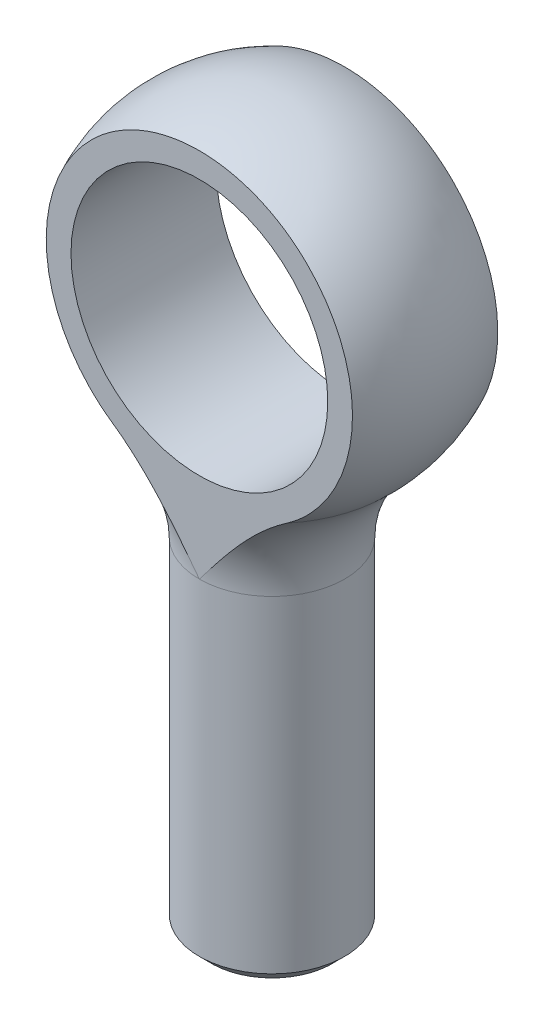
ISO-10303-21;
HEADER;
FILE_DESCRIPTION(('STEP AP214'),'2;1');
FILE_NAME('part.step','',(''),(''),'','','');
FILE_SCHEMA(('AUTOMOTIVE_DESIGN { 1 0 10303 214 1 1 1 1 }'));
ENDSEC;
DATA;
#1=APPLICATION_CONTEXT('core data for automotive mechanical design processes');
#2=APPLICATION_PROTOCOL_DEFINITION('international standard','automotive_design',2000,#1);
#3=PRODUCT_CONTEXT('',#1,'mechanical');
#4=PRODUCT('Part','Part','',(#3));
#5=PRODUCT_RELATED_PRODUCT_CATEGORY('part','',(#4));
#6=PRODUCT_DEFINITION_FORMATION('','',#4);
#7=PRODUCT_DEFINITION_CONTEXT('part definition',#1,'design');
#8=PRODUCT_DEFINITION('design','',#6,#7);
#9=PRODUCT_DEFINITION_SHAPE('','',#8);
#10=(LENGTH_UNIT() NAMED_UNIT(*) SI_UNIT(.MILLI.,.METRE.));
#11=(NAMED_UNIT(*) PLANE_ANGLE_UNIT() SI_UNIT($,.RADIAN.));
#12=(NAMED_UNIT(*) SI_UNIT($,.STERADIAN.) SOLID_ANGLE_UNIT());
#13=UNCERTAINTY_MEASURE_WITH_UNIT(LENGTH_MEASURE(1.E-05),#10,'distance_accuracy_value','');
#14=(GEOMETRIC_REPRESENTATION_CONTEXT(3) GLOBAL_UNCERTAINTY_ASSIGNED_CONTEXT((#13)) GLOBAL_UNIT_ASSIGNED_CONTEXT((#10,
#11,#12)) REPRESENTATION_CONTEXT('',''));
#15=CARTESIAN_POINT('',(0.,0.,0.));
#16=DIRECTION('',(0.,0.,1.));
#17=DIRECTION('',(1.,0.,0.));
#18=AXIS2_PLACEMENT_3D('',#15,#16,#17);
#19=CARTESIAN_POINT('',(-1.2490009027033E-13,0.,0.));
#20=DIRECTION('',(0.,-1.,0.));
#21=DIRECTION('',(1.,0.,0.));
#22=AXIS2_PLACEMENT_3D('',#19,#20,#21);
#23=TOROIDAL_SURFACE('',#22,25.7968750000002,16.271875);
#24=CARTESIAN_POINT('',(-1.2490009027033E-13,0.,-9.52500000000006));
#25=CARTESIAN_POINT('',(-0.005167452615442,0.00675402738967501,-9.52500000000004));
#26=CARTESIAN_POINT('',(-0.0103349050174557,0.0135080543500059,-9.52500000000002));
#27=CARTESIAN_POINT('',(-0.819890846154989,1.07162209413467,-9.52499999999671));
#28=CARTESIAN_POINT('',(-1.6243981365314,2.12287651508349,-9.52499999999914));
#29=CARTESIAN_POINT('',(-3.27258965228614,4.19596805092888,-9.52500000000086));
#30=CARTESIAN_POINT('',(-4.11629001539579,5.21779276254316,-9.52500000000016));
#31=CARTESIAN_POINT('',(-5.43422399427642,6.70108527546252,-9.52499999999992));
#32=CARTESIAN_POINT('',(-5.8814080549913,7.18643995510749,-9.52499999999998));
#33=CARTESIAN_POINT('',(-6.79686719335257,8.13675767374777,-9.52500000000002));
#34=CARTESIAN_POINT('',(-7.26513799072382,8.60172481360979,-9.52500000000001));
#35=CARTESIAN_POINT('',(-8.22494490587444,9.50596395638035,-9.525));
#36=CARTESIAN_POINT('',(-8.71645307517112,9.94526547401466,-9.525));
#37=CARTESIAN_POINT('',(-9.72489488562016,10.7934849178261,-9.525));
#38=CARTESIAN_POINT('',(-10.241820436259,11.2024124095215,-9.525));
#39=CARTESIAN_POINT('',(-11.2628755930654,11.9557231411914,-9.525));
#40=CARTESIAN_POINT('',(-11.7651280785616,12.3026429432189,-9.525));
#41=CARTESIAN_POINT('',(-12.7921557222474,12.9615466290334,-9.525));
#42=CARTESIAN_POINT('',(-13.3169312060761,13.2735300074716,-9.525));
#43=CARTESIAN_POINT('',(-14.3887181444806,13.8585078038558,-9.525));
#44=CARTESIAN_POINT('',(-14.9357565296614,14.1314530825034,-9.525));
#45=CARTESIAN_POINT('',(-16.0496474100231,14.6335522772498,-9.525));
#46=CARTESIAN_POINT('',(-16.6164996348075,14.8627067906792,-9.525));
#47=CARTESIAN_POINT('',(-17.7719232113065,15.2747207529869,-9.525));
#48=CARTESIAN_POINT('',(-18.3606307941651,15.457200062585,-9.525));
#49=CARTESIAN_POINT('',(-19.5519253088343,15.769593000701,-9.525));
#50=CARTESIAN_POINT('',(-20.1545126260029,15.8995051678767,-9.525));
#51=CARTESIAN_POINT('',(-21.3688005261816,16.1032807027354,-9.525));
#52=CARTESIAN_POINT('',(-21.9804956699349,16.1771762549466,-9.525));
#53=CARTESIAN_POINT('',(-23.2081704713034,16.266218142429,-9.525));
#54=CARTESIAN_POINT('',(-23.8241496986913,16.2813702940162,-9.525));
#55=CARTESIAN_POINT('',(-25.0081486066532,16.2520051051225,-9.525));
#56=CARTESIAN_POINT('',(-25.5762785257975,16.2119057671712,-9.525));
#57=CARTESIAN_POINT('',(-26.7063292474793,16.0786886494223,-9.525));
#58=CARTESIAN_POINT('',(-27.2682502225397,15.9855723465587,-9.525));
#59=CARTESIAN_POINT('',(-28.3802273242851,15.7460173734579,-9.525));
#60=CARTESIAN_POINT('',(-28.930291440638,15.599615879684,-9.525));
#61=CARTESIAN_POINT('',(-30.0134900419584,15.2537865231115,-9.525));
#62=CARTESIAN_POINT('',(-30.5466262905328,15.0543642046415,-9.525));
#63=CARTESIAN_POINT('',(-31.5292408711952,14.6299727961571,-9.525));
#64=CARTESIAN_POINT('',(-31.9812019552055,14.4107350632246,-9.525));
#65=CARTESIAN_POINT('',(-32.8637755631185,13.9329731540565,-9.525));
#66=CARTESIAN_POINT('',(-33.2943917662423,13.6744557799101,-9.525));
#67=CARTESIAN_POINT('',(-34.1319594796922,13.1188138009447,-9.525));
#68=CARTESIAN_POINT('',(-34.5388346338099,12.8215736051812,-9.525));
#69=CARTESIAN_POINT('',(-35.1275294290994,12.3488461200751,-9.525));
#70=CARTESIAN_POINT('',(-35.3202205869429,12.1867320448451,-9.525));
#71=CARTESIAN_POINT('',(-35.697971760415,11.8538322993533,-9.525));
#72=CARTESIAN_POINT('',(-35.8830315176103,11.6830463358587,-9.525));
#73=CARTESIAN_POINT('',(-36.0640839624217,11.5080600593659,-9.525));
#74=B_SPLINE_CURVE_WITH_KNOTS('',3,(#24,#25,#26,#27,#28,#29,#30,#31,#32,#33,#34,#35,#36,#37,#38,
#39,#40,#41,#42,#43,#44,#45,#46,#47,#48,#49,#50,#51,#52,#53,#54,#55,#56,#57,#58,#59,#60,#61,#62,
#63,#64,#65,#66,#67,#68,#69,#70,#71,#72,#73),.UNSPECIFIED.,.F.,.F.,(4,2,2,2,2,2,2,2,2,2,2,2,2,2,
2,2,2,2,2,2,2,2,2,2,4),(0.,0.0255122519586187,3.99685840168091,7.96985450188092,
9.94918880689772,11.9281231335206,13.9047350367502,15.8807217941987,17.7106923889335,
19.5406894504273,21.3729701255459,23.205225805549,25.0519602233873,26.8987459760645,
28.744469846074,30.5900109621519,32.2962353715926,34.0024122517676,35.7074010267239,
37.4122115829745,38.9172645106138,40.4220571033628,41.9314492191524,42.6866649313001,
43.4419061974647),.UNSPECIFIED.);
#75=CARTESIAN_POINT('',(-1.2490009027033E-13,0.,-9.525));
#76=VERTEX_POINT('',#75);
#77=CARTESIAN_POINT('',(-11.4488886923738,12.0780927835052,-9.525));
#78=VERTEX_POINT('',#77);
#79=EDGE_CURVE('E60',#76,#78,#74,.T.);
#80=ORIENTED_EDGE('',*,*,#79,.F.);
#81=CARTESIAN_POINT('',(0.,0.,0.));
#82=DIRECTION('',(0.,1.,0.));
#83=DIRECTION('',(-1.,0.,0.));
#84=AXIS2_PLACEMENT_3D('',#81,#82,#83);
#85=CIRCLE('',#84,9.525);
#86=CARTESIAN_POINT('',(-1.2490009027033E-13,0.,9.525));
#87=VERTEX_POINT('',#86);
#88=EDGE_CURVE('E88',#76,#87,#85,.T.);
#89=ORIENTED_EDGE('',*,*,#88,.T.);
#90=CARTESIAN_POINT('',(-1.2490009027033E-13,0.,9.52500000000006));
#91=CARTESIAN_POINT('',(-0.00516745261544182,0.00675402738967626,9.52500000000004));
#92=CARTESIAN_POINT('',(-0.0103349050174554,0.0135080543500073,9.52500000000002));
#93=CARTESIAN_POINT('',(-0.819890846155014,1.07162209413477,9.52499999999671));
#94=CARTESIAN_POINT('',(-1.6243981365315,2.12287651508363,9.52499999999914));
#95=CARTESIAN_POINT('',(-3.27258965228637,4.19596805092915,9.52500000000086));
#96=CARTESIAN_POINT('',(-4.11629001539607,5.21779276254349,9.52500000000016));
#97=CARTESIAN_POINT('',(-5.43422399427681,6.70108527546294,9.52499999999992));
#98=CARTESIAN_POINT('',(-5.88140805499172,7.18643995510794,9.52499999999998));
#99=CARTESIAN_POINT('',(-6.79686719335306,8.13675767374828,9.52500000000002));
#100=CARTESIAN_POINT('',(-7.26513799072436,8.60172481361032,9.52500000000001));
#101=CARTESIAN_POINT('',(-8.22494490587507,9.50596395638092,9.525));
#102=CARTESIAN_POINT('',(-8.71645307517178,9.94526547401525,9.525));
#103=CARTESIAN_POINT('',(-9.72489488562091,10.7934849178267,9.525));
#104=CARTESIAN_POINT('',(-10.2418204362598,11.2024124095222,9.525));
#105=CARTESIAN_POINT('',(-11.2628755930662,11.955723141192,9.525));
#106=CARTESIAN_POINT('',(-11.7651280785624,12.3026429432195,9.525));
#107=CARTESIAN_POINT('',(-12.7921557222482,12.9615466290339,9.525));
#108=CARTESIAN_POINT('',(-13.3169312060769,13.2735300074721,9.525));
#109=CARTESIAN_POINT('',(-14.3887181444814,13.8585078038562,9.525));
#110=CARTESIAN_POINT('',(-14.9357565296621,14.1314530825037,9.525));
#111=CARTESIAN_POINT('',(-16.0496474100238,14.6335522772501,9.525));
#112=CARTESIAN_POINT('',(-16.6164996348082,14.8627067906795,9.525));
#113=CARTESIAN_POINT('',(-17.7719232113071,15.2747207529872,9.525));
#114=CARTESIAN_POINT('',(-18.3606307941657,15.4572000625852,9.525));
#115=CARTESIAN_POINT('',(-19.5519253088349,15.7695930007012,9.525));
#116=CARTESIAN_POINT('',(-20.1545126260035,15.8995051678768,9.525));
#117=CARTESIAN_POINT('',(-21.3688005261821,16.1032807027355,9.525));
#118=CARTESIAN_POINT('',(-21.9804956699354,16.1771762549467,9.525));
#119=CARTESIAN_POINT('',(-23.2081704713038,16.266218142429,9.525));
#120=CARTESIAN_POINT('',(-23.8241496986917,16.2813702940162,9.525));
#121=CARTESIAN_POINT('',(-25.0081486066536,16.2520051051225,9.525));
#122=CARTESIAN_POINT('',(-25.5762785257978,16.2119057671711,9.525));
#123=CARTESIAN_POINT('',(-26.7063292474797,16.0786886494223,9.525));
#124=CARTESIAN_POINT('',(-27.26825022254,15.9855723465586,9.525));
#125=CARTESIAN_POINT('',(-28.3802273242854,15.7460173734578,9.525));
#126=CARTESIAN_POINT('',(-28.9302914406383,15.5996158796839,9.525));
#127=CARTESIAN_POINT('',(-30.0134900419587,15.2537865231113,9.525));
#128=CARTESIAN_POINT('',(-30.5466262905331,15.0543642046414,9.525));
#129=CARTESIAN_POINT('',(-31.5292408711955,14.6299727961569,9.525));
#130=CARTESIAN_POINT('',(-31.9812019552058,14.4107350632245,9.525));
#131=CARTESIAN_POINT('',(-32.8637755631187,13.9329731540564,9.525));
#132=CARTESIAN_POINT('',(-33.2943917662426,13.67445577991,9.525));
#133=CARTESIAN_POINT('',(-34.1319594796924,13.1188138009445,9.525));
#134=CARTESIAN_POINT('',(-34.5388346338101,12.821573605181,9.525));
#135=CARTESIAN_POINT('',(-35.1275294290996,12.3488461200749,9.525));
#136=CARTESIAN_POINT('',(-35.3202205869431,12.186732044845,9.525));
#137=CARTESIAN_POINT('',(-35.6979717604152,11.8538322993531,9.525));
#138=CARTESIAN_POINT('',(-35.8830315176105,11.6830463358585,9.525));
#139=CARTESIAN_POINT('',(-36.0640839624219,11.5080600593657,9.525));
#140=B_SPLINE_CURVE_WITH_KNOTS('',3,(#90,#91,#92,#93,#94,#95,#96,#97,#98,#99,#100,#101,#102,
#103,#104,#105,#106,#107,#108,#109,#110,#111,#112,#113,#114,#115,#116,#117,#118,#119,#120,#121,
#122,#123,#124,#125,#126,#127,#128,#129,#130,#131,#132,#133,#134,#135,#136,#137,#138,#139),
.UNSPECIFIED.,.F.,.F.,(4,2,2,2,2,2,2,2,2,2,2,2,2,2,2,2,2,2,2,2,2,2,2,2,4),(0.,
0.0255122519586187,3.99685840168117,7.96985450188145,9.94918880689839,11.9281231335214,
13.9047350367512,15.8807217941998,17.7106923889345,19.5406894504282,21.3729701255468,
23.2052258055497,25.0519602233879,26.8987459760651,28.7444698460745,30.5900109621523,
32.2962353715929,34.002412251768,35.7074010267242,37.4122115829748,38.9172645106141,
40.4220571033631,41.9314492191527,42.6866649313003,43.441906197465),.UNSPECIFIED.);
#141=CARTESIAN_POINT('',(-11.4488886923738,12.0780927835052,9.525));
#142=VERTEX_POINT('',#141);
#143=EDGE_CURVE('E92',#142,#87,#140,.F.);
#144=ORIENTED_EDGE('',*,*,#143,.F.);
#145=CARTESIAN_POINT('',(0.,12.0780927835052,0.));
#146=DIRECTION('',(0.,-1.,0.));
#147=DIRECTION('',(1.,0.,0.));
#148=AXIS2_PLACEMENT_3D('',#145,#146,#147);
#149=CIRCLE('',#148,14.8930412371135);
#150=EDGE_CURVE('E91',#142,#78,#149,.T.);
#151=ORIENTED_EDGE('',*,*,#150,.T.);
#152=EDGE_LOOP('',(#80,#89,#144,#151));
#153=FACE_BOUND('',#152,.T.);
#154=ADVANCED_FACE('F46',(#153),#23,.F.);
#155=CARTESIAN_POINT('',(0.,-44.45,0.));
#156=DIRECTION('',(0.,1.,0.));
#157=DIRECTION('',(-1.,0.,0.));
#158=AXIS2_PLACEMENT_3D('',#155,#156,#157);
#159=PLANE('',#158);
#160=CARTESIAN_POINT('',(0.,-44.45,0.));
#161=DIRECTION('',(0.,1.,0.));
#162=DIRECTION('',(-1.,0.,0.));
#163=AXIS2_PLACEMENT_3D('',#160,#161,#162);
#164=CIRCLE('',#163,7.93749999999998);
#165=CARTESIAN_POINT('',(-7.93749999999997,-44.45,0.));
#166=VERTEX_POINT('',#165);
#167=EDGE_CURVE('E103',#166,#166,#164,.F.);
#168=ORIENTED_EDGE('',*,*,#167,.T.);
#169=EDGE_LOOP('',(#168));
#170=FACE_BOUND('',#169,.T.);
#171=ADVANCED_FACE('F140',(#170),#159,.F.);
#172=CARTESIAN_POINT('',(0.,50.8,0.));
#173=DIRECTION('',(0.,1.,0.));
#174=DIRECTION('',(-1.,0.,0.));
#175=AXIS2_PLACEMENT_3D('',#172,#173,#174);
#176=CYLINDRICAL_SURFACE('',#175,9.525);
#177=CARTESIAN_POINT('',(0.,-42.8625,0.));
#178=DIRECTION('',(0.,1.,0.));
#179=DIRECTION('',(-1.,0.,0.));
#180=AXIS2_PLACEMENT_3D('',#177,#178,#179);
#181=CIRCLE('',#180,9.525);
#182=CARTESIAN_POINT('',(-9.525,-42.8625,0.));
#183=VERTEX_POINT('',#182);
#184=EDGE_CURVE('E101',#183,#183,#181,.T.);
#185=ORIENTED_EDGE('',*,*,#184,.T.);
#186=EDGE_LOOP('',(#185));
#187=FACE_BOUND('',#186,.T.);
#188=EDGE_CURVE('E97',#87,#76,#85,.T.);
#189=ORIENTED_EDGE('',*,*,#188,.F.);
#190=ORIENTED_EDGE('',*,*,#88,.F.);
#191=EDGE_LOOP('',(#189,#190));
#192=FACE_BOUND('',#191,.T.);
#193=ADVANCED_FACE('F96',(#187,#192),#176,.T.);
#194=CARTESIAN_POINT('',(0.,-42.8625,0.));
#195=DIRECTION('',(0.,1.,0.));
#196=DIRECTION('',(-1.,0.,0.));
#197=AXIS2_PLACEMENT_3D('',#194,#195,#196);
#198=CONICAL_SURFACE('',#197,9.525,0.78539816339745);
#199=ORIENTED_EDGE('',*,*,#167,.F.);
#200=EDGE_LOOP('',(#199));
#201=FACE_BOUND('',#200,.T.);
#202=ORIENTED_EDGE('',*,*,#184,.F.);
#203=EDGE_LOOP('',(#202));
#204=FACE_BOUND('',#203,.T.);
#205=ADVANCED_FACE('F48',(#201,#204),#198,.T.);
#206=CARTESIAN_POINT('',(-1.2490009027033E-13,0.,-9.52500000000006));
#207=CARTESIAN_POINT('',(0.00516745261519223,0.00675402738967499,-9.52500000000004));
#208=CARTESIAN_POINT('',(0.010334905017206,0.0135080543500058,-9.52500000000002));
#209=CARTESIAN_POINT('',(0.819890846154744,1.07162209413467,-9.52499999999671));
#210=CARTESIAN_POINT('',(1.62439813653116,2.12287651508348,-9.52499999999914));
#211=CARTESIAN_POINT('',(3.27258965228591,4.19596805092887,-9.52500000000086));
#212=CARTESIAN_POINT('',(4.11629001539557,5.21779276254313,-9.52500000000016));
#213=CARTESIAN_POINT('',(5.4342239942762,6.70108527546249,-9.52499999999992));
#214=CARTESIAN_POINT('',(5.88140805499108,7.18643995510746,-9.52499999999998));
#215=CARTESIAN_POINT('',(6.79686719335235,8.13675767374774,-9.52500000000002));
#216=CARTESIAN_POINT('',(7.26513799072361,8.60172481360976,-9.52500000000001));
#217=CARTESIAN_POINT('',(8.22494490587424,9.50596395638031,-9.525));
#218=CARTESIAN_POINT('',(8.71645307517091,9.94526547401462,-9.525));
#219=CARTESIAN_POINT('',(9.72489488561996,10.7934849178261,-9.525));
#220=CARTESIAN_POINT('',(10.2418204362588,11.2024124095215,-9.525));
#221=CARTESIAN_POINT('',(11.2628755930652,11.9557231411914,-9.525));
#222=CARTESIAN_POINT('',(11.7651280785614,12.3026429432189,-9.525));
#223=CARTESIAN_POINT('',(12.7921557222472,12.9615466290333,-9.525));
#224=CARTESIAN_POINT('',(13.3169312060759,13.2735300074716,-9.525));
#225=CARTESIAN_POINT('',(14.3887181444804,13.8585078038557,-9.525));
#226=CARTESIAN_POINT('',(14.9357565296612,14.1314530825033,-9.525));
#227=CARTESIAN_POINT('',(16.0496474100229,14.6335522772498,-9.525));
#228=CARTESIAN_POINT('',(16.6164996348073,14.8627067906791,-9.525));
#229=CARTESIAN_POINT('',(17.7719232113063,15.2747207529869,-9.525));
#230=CARTESIAN_POINT('',(18.3606307941649,15.4572000625849,-9.525));
#231=CARTESIAN_POINT('',(19.5519253088341,15.7695930007009,-9.525));
#232=CARTESIAN_POINT('',(20.1545126260028,15.8995051678766,-9.525));
#233=CARTESIAN_POINT('',(21.3688005261814,16.1032807027353,-9.525));
#234=CARTESIAN_POINT('',(21.9804956699347,16.1771762549465,-9.525));
#235=CARTESIAN_POINT('',(23.2081704713032,16.2662181424289,-9.525));
#236=CARTESIAN_POINT('',(23.8241496986911,16.281370294016,-9.525));
#237=CARTESIAN_POINT('',(25.0081486066531,16.2520051051224,-9.525));
#238=CARTESIAN_POINT('',(25.5762785257973,16.2119057671711,-9.525));
#239=CARTESIAN_POINT('',(26.7063292474791,16.0786886494222,-9.525));
#240=CARTESIAN_POINT('',(27.2682502225395,15.9855723465585,-9.525));
#241=CARTESIAN_POINT('',(28.3802273242849,15.7460173734577,-9.525));
#242=CARTESIAN_POINT('',(28.9302914406378,15.5996158796838,-9.525));
#243=CARTESIAN_POINT('',(30.0134900419582,15.2537865231113,-9.525));
#244=CARTESIAN_POINT('',(30.5466262905326,15.0543642046414,-9.525));
#245=CARTESIAN_POINT('',(31.529240871195,14.6299727961569,-9.525));
#246=CARTESIAN_POINT('',(31.9812019552053,14.4107350632245,-9.525));
#247=CARTESIAN_POINT('',(32.8637755631183,13.9329731540564,-9.525));
#248=CARTESIAN_POINT('',(33.2943917662421,13.67445577991,-9.525));
#249=CARTESIAN_POINT('',(34.131959479692,13.1188138009445,-9.525));
#250=CARTESIAN_POINT('',(34.5388346338097,12.821573605181,-9.525));
#251=CARTESIAN_POINT('',(35.1275294290992,12.3488461200749,-9.525));
#252=CARTESIAN_POINT('',(35.3202205869427,12.186732044845,-9.525));
#253=CARTESIAN_POINT('',(35.6979717604148,11.8538322993531,-9.525));
#254=CARTESIAN_POINT('',(35.8830315176102,11.6830463358586,-9.525));
#255=CARTESIAN_POINT('',(36.0640839624215,11.5080600593657,-9.525));
#256=B_SPLINE_CURVE_WITH_KNOTS('',3,(#206,#207,#208,#209,#210,#211,#212,#213,#214,#215,#216,
#217,#218,#219,#220,#221,#222,#223,#224,#225,#226,#227,#228,#229,#230,#231,#232,#233,#234,#235,
#236,#237,#238,#239,#240,#241,#242,#243,#244,#245,#246,#247,#248,#249,#250,#251,#252,#253,#254,
#255),.UNSPECIFIED.,.F.,.F.,(4,2,2,2,2,2,2,2,2,2,2,2,2,2,2,2,2,2,2,2,2,2,2,2,4),(0.,
0.0255122519586188,3.99685840168091,7.96985450188092,9.94918880689772,11.9281231335206,
13.9047350367502,15.8807217941987,17.7106923889335,19.5406894504273,21.3729701255459,
23.205225805549,25.0519602233873,26.8987459760645,28.744469846074,30.5900109621519,
32.2962353715926,34.0024122517677,35.7074010267239,37.4122115829745,38.9172645106137,
40.4220571033628,41.9314492191524,42.6866649313001,43.4419061974647),.UNSPECIFIED.);
#257=CARTESIAN_POINT('',(11.4488886923736,12.0780927835052,-9.525));
#258=VERTEX_POINT('',#257);
#259=EDGE_CURVE('E79',#258,#76,#256,.F.);
#260=ORIENTED_EDGE('',*,*,#259,.F.);
#261=CARTESIAN_POINT('',(11.4488886923736,12.0780927835052,9.525));
#262=VERTEX_POINT('',#261);
#263=EDGE_CURVE('E68',#258,#262,#149,.T.);
#264=ORIENTED_EDGE('',*,*,#263,.T.);
#265=CARTESIAN_POINT('',(-1.2490009027033E-13,0.,9.52500000000006));
#266=CARTESIAN_POINT('',(0.00516745261519205,0.00675402738967624,9.52500000000004));
#267=CARTESIAN_POINT('',(0.0103349050172056,0.0135080543500072,9.52500000000002));
#268=CARTESIAN_POINT('',(0.819890846154769,1.07162209413476,9.52499999999671));
#269=CARTESIAN_POINT('',(1.62439813653126,2.12287651508363,9.52499999999914));
#270=CARTESIAN_POINT('',(3.27258965228613,4.19596805092914,9.52500000000086));
#271=CARTESIAN_POINT('',(4.11629001539585,5.21779276254347,9.52500000000016));
#272=CARTESIAN_POINT('',(5.43422399427659,6.70108527546292,9.52499999999992));
#273=CARTESIAN_POINT('',(5.8814080549915,7.18643995510791,9.52499999999998));
#274=CARTESIAN_POINT('',(6.79686719335285,8.13675767374825,9.52500000000002));
#275=CARTESIAN_POINT('',(7.26513799072415,8.60172481361029,9.52500000000001));
#276=CARTESIAN_POINT('',(8.22494490587486,9.50596395638088,9.525));
#277=CARTESIAN_POINT('',(8.71645307517158,9.9452654740152,9.525));
#278=CARTESIAN_POINT('',(9.72489488562071,10.7934849178267,9.525));
#279=CARTESIAN_POINT('',(10.2418204362596,11.2024124095221,9.525));
#280=CARTESIAN_POINT('',(11.262875593066,11.955723141192,9.525));
#281=CARTESIAN_POINT('',(11.7651280785622,12.3026429432194,9.525));
#282=CARTESIAN_POINT('',(12.792155722248,12.9615466290338,9.525));
#283=CARTESIAN_POINT('',(13.3169312060767,13.273530007472,9.525));
#284=CARTESIAN_POINT('',(14.3887181444812,13.8585078038561,9.525));
#285=CARTESIAN_POINT('',(14.9357565296619,14.1314530825037,9.525));
#286=CARTESIAN_POINT('',(16.0496474100237,14.6335522772501,9.525));
#287=CARTESIAN_POINT('',(16.616499634808,14.8627067906794,9.525));
#288=CARTESIAN_POINT('',(17.771923211307,15.2747207529871,9.525));
#289=CARTESIAN_POINT('',(18.3606307941655,15.4572000625851,9.525));
#290=CARTESIAN_POINT('',(19.5519253088347,15.7695930007011,9.525));
#291=CARTESIAN_POINT('',(20.1545126260033,15.8995051678767,9.525));
#292=CARTESIAN_POINT('',(21.3688005261819,16.1032807027354,9.525));
#293=CARTESIAN_POINT('',(21.9804956699352,16.1771762549466,9.525));
#294=CARTESIAN_POINT('',(23.2081704713036,16.2662181424289,9.525));
#295=CARTESIAN_POINT('',(23.8241496986916,16.281370294016,9.525));
#296=CARTESIAN_POINT('',(25.0081486066534,16.2520051051224,9.525));
#297=CARTESIAN_POINT('',(25.5762785257977,16.211905767171,9.525));
#298=CARTESIAN_POINT('',(26.7063292474795,16.0786886494221,9.525));
#299=CARTESIAN_POINT('',(27.2682502225399,15.9855723465585,9.525));
#300=CARTESIAN_POINT('',(28.3802273242852,15.7460173734576,9.525));
#301=CARTESIAN_POINT('',(28.9302914406382,15.5996158796837,9.525));
#302=CARTESIAN_POINT('',(30.0134900419586,15.2537865231112,9.525));
#303=CARTESIAN_POINT('',(30.5466262905329,15.0543642046412,9.525));
#304=CARTESIAN_POINT('',(31.5292408711953,14.6299727961568,9.525));
#305=CARTESIAN_POINT('',(31.9812019552056,14.4107350632244,9.525));
#306=CARTESIAN_POINT('',(32.8637755631185,13.9329731540562,9.525));
#307=CARTESIAN_POINT('',(33.2943917662424,13.6744557799098,9.525));
#308=CARTESIAN_POINT('',(34.1319594796922,13.1188138009444,9.525));
#309=CARTESIAN_POINT('',(34.5388346338099,12.8215736051808,9.525));
#310=CARTESIAN_POINT('',(35.1275294290995,12.3488461200748,9.525));
#311=CARTESIAN_POINT('',(35.3202205869429,12.1867320448448,9.525));
#312=CARTESIAN_POINT('',(35.697971760415,11.8538322993529,9.525));
#313=CARTESIAN_POINT('',(35.8830315176104,11.6830463358584,9.525));
#314=CARTESIAN_POINT('',(36.0640839624217,11.5080600593655,9.525));
#315=B_SPLINE_CURVE_WITH_KNOTS('',3,(#265,#266,#267,#268,#269,#270,#271,#272,#273,#274,#275,
#276,#277,#278,#279,#280,#281,#282,#283,#284,#285,#286,#287,#288,#289,#290,#291,#292,#293,#294,
#295,#296,#297,#298,#299,#300,#301,#302,#303,#304,#305,#306,#307,#308,#309,#310,#311,#312,#313,
#314),.UNSPECIFIED.,.F.,.F.,(4,2,2,2,2,2,2,2,2,2,2,2,2,2,2,2,2,2,2,2,2,2,2,2,4),(0.,
0.0255122519586188,3.99685840168117,7.96985450188144,9.94918880689838,11.9281231335214,
13.9047350367512,15.8807217941998,17.7106923889345,19.5406894504282,21.3729701255467,
23.2052258055497,25.0519602233879,26.8987459760651,28.7444698460745,30.5900109621523,
32.2962353715929,34.002412251768,35.7074010267242,37.4122115829748,38.9172645106141,
40.4220571033631,41.9314492191527,42.6866649313003,43.441906197465),.UNSPECIFIED.);
#316=EDGE_CURVE('E100',#87,#262,#315,.T.);
#317=ORIENTED_EDGE('',*,*,#316,.F.);
#318=ORIENTED_EDGE('',*,*,#188,.T.);
#319=EDGE_LOOP('',(#260,#264,#317,#318));
#320=FACE_BOUND('',#319,.T.);
#321=ADVANCED_FACE('F99',(#320),#23,.F.);
#322=CARTESIAN_POINT('',(0.,28.575,0.));
#323=DIRECTION('',(0.,-1.,0.));
#324=DIRECTION('',(1.,0.,0.));
#325=AXIS2_PLACEMENT_3D('',#322,#323,#324);
#326=SPHERICAL_SURFACE('',#325,22.225);
#327=CARTESIAN_POINT('',(0.,28.575,-9.525));
#328=DIRECTION('',(0.,0.,1.));
#329=DIRECTION('',(1.,0.,0.));
#330=AXIS2_PLACEMENT_3D('',#327,#328,#329);
#331=CIRCLE('',#330,20.0804631420692);
#332=EDGE_CURVE('E13',#78,#258,#331,.F.);
#333=ORIENTED_EDGE('',*,*,#332,.F.);
#334=ORIENTED_EDGE('',*,*,#150,.F.);
#335=CARTESIAN_POINT('',(0.,28.575,9.525));
#336=DIRECTION('',(0.,0.,-1.));
#337=DIRECTION('',(0.,1.,0.));
#338=AXIS2_PLACEMENT_3D('',#335,#336,#337);
#339=CIRCLE('',#338,20.0804631420692);
#340=EDGE_CURVE('E54',#262,#142,#339,.F.);
#341=ORIENTED_EDGE('',*,*,#340,.F.);
#342=ORIENTED_EDGE('',*,*,#263,.F.);
#343=EDGE_LOOP('',(#333,#334,#341,#342));
#344=FACE_BOUND('',#343,.T.);
#345=ADVANCED_FACE('F114',(#344),#326,.T.);
#346=CARTESIAN_POINT('',(-22.225,50.8,9.525));
#347=DIRECTION('',(0.,0.,-1.));
#348=DIRECTION('',(0.,1.,0.));
#349=AXIS2_PLACEMENT_3D('',#346,#347,#348);
#350=PLANE('',#349);
#351=CARTESIAN_POINT('',(0.,28.575,9.525));
#352=DIRECTION('',(0.,0.,1.));
#353=DIRECTION('',(1.,0.,0.));
#354=AXIS2_PLACEMENT_3D('',#351,#352,#353);
#355=CIRCLE('',#354,16.8354375);
#356=CARTESIAN_POINT('',(16.8354375,28.575,9.525));
#357=VERTEX_POINT('',#356);
#358=EDGE_CURVE('E201',#357,#357,#355,.T.);
#359=ORIENTED_EDGE('',*,*,#358,.F.);
#360=EDGE_LOOP('',(#359));
#361=FACE_BOUND('',#360,.T.);
#362=ORIENTED_EDGE('',*,*,#316,.T.);
#363=ORIENTED_EDGE('',*,*,#340,.T.);
#364=ORIENTED_EDGE('',*,*,#143,.T.);
#365=EDGE_LOOP('',(#362,#363,#364));
#366=FACE_BOUND('',#365,.T.);
#367=ADVANCED_FACE('F111',(#361,#366),#350,.F.);
#368=CARTESIAN_POINT('',(-22.225,50.8,-9.525));
#369=DIRECTION('',(0.,0.,1.));
#370=DIRECTION('',(1.,0.,0.));
#371=AXIS2_PLACEMENT_3D('',#368,#369,#370);
#372=PLANE('',#371);
#373=CARTESIAN_POINT('',(0.,28.575,-9.525));
#374=DIRECTION('',(0.,0.,1.));
#375=DIRECTION('',(1.,0.,0.));
#376=AXIS2_PLACEMENT_3D('',#373,#374,#375);
#377=CIRCLE('',#376,16.8354375);
#378=CARTESIAN_POINT('',(16.8354375,28.575,-9.525));
#379=VERTEX_POINT('',#378);
#380=EDGE_CURVE('E82',#379,#379,#377,.T.);
#381=ORIENTED_EDGE('',*,*,#380,.T.);
#382=EDGE_LOOP('',(#381));
#383=FACE_BOUND('',#382,.T.);
#384=ORIENTED_EDGE('',*,*,#79,.T.);
#385=ORIENTED_EDGE('',*,*,#332,.T.);
#386=ORIENTED_EDGE('',*,*,#259,.T.);
#387=EDGE_LOOP('',(#384,#385,#386));
#388=FACE_BOUND('',#387,.T.);
#389=ADVANCED_FACE('F80',(#383,#388),#372,.F.);
#390=CARTESIAN_POINT('',(0.,28.575,-9.525));
#391=DIRECTION('',(0.,0.,1.));
#392=DIRECTION('',(1.,0.,0.));
#393=AXIS2_PLACEMENT_3D('',#390,#391,#392);
#394=CYLINDRICAL_SURFACE('',#393,16.8354375);
#395=ORIENTED_EDGE('',*,*,#380,.F.);
#396=EDGE_LOOP('',(#395));
#397=FACE_BOUND('',#396,.T.);
#398=ORIENTED_EDGE('',*,*,#358,.T.);
#399=EDGE_LOOP('',(#398));
#400=FACE_BOUND('',#399,.T.);
#401=ADVANCED_FACE('F184',(#397,#400),#394,.F.);
#402=CLOSED_SHELL('',(#154,#171,#193,#205,#321,#345,#367,#389,#401));
#403=MANIFOLD_SOLID_BREP('B2',#402);
#404=ADVANCED_BREP_SHAPE_REPRESENTATION('',(#18,#403),#14);
#405=SHAPE_DEFINITION_REPRESENTATION(#9,#404);
ENDSEC;
END-ISO-10303-21;
